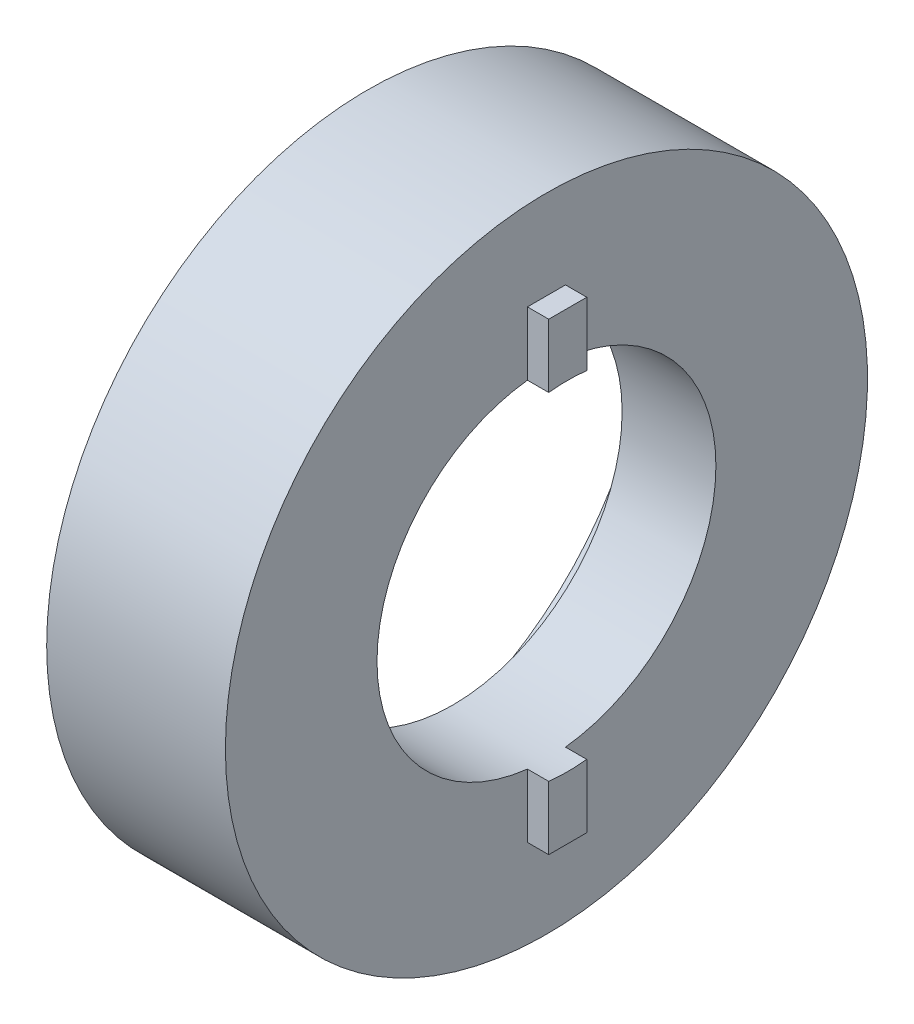
ISO-10303-21;
HEADER;
FILE_DESCRIPTION(('STEP AP214'),'2;1');
FILE_NAME('part.step','',(''),(''),'','','');
FILE_SCHEMA(('AUTOMOTIVE_DESIGN { 1 0 10303 214 1 1 1 1 }'));
ENDSEC;
DATA;
#1=APPLICATION_CONTEXT('core data for automotive mechanical design processes');
#2=APPLICATION_PROTOCOL_DEFINITION('international standard','automotive_design',2000,#1);
#3=PRODUCT_CONTEXT('',#1,'mechanical');
#4=PRODUCT('Part','Part','',(#3));
#5=PRODUCT_RELATED_PRODUCT_CATEGORY('part','',(#4));
#6=PRODUCT_DEFINITION_FORMATION('','',#4);
#7=PRODUCT_DEFINITION_CONTEXT('part definition',#1,'design');
#8=PRODUCT_DEFINITION('design','',#6,#7);
#9=PRODUCT_DEFINITION_SHAPE('','',#8);
#10=(LENGTH_UNIT() NAMED_UNIT(*) SI_UNIT(.MILLI.,.METRE.));
#11=(NAMED_UNIT(*) PLANE_ANGLE_UNIT() SI_UNIT($,.RADIAN.));
#12=(NAMED_UNIT(*) SI_UNIT($,.STERADIAN.) SOLID_ANGLE_UNIT());
#13=UNCERTAINTY_MEASURE_WITH_UNIT(LENGTH_MEASURE(1.E-05),#10,'distance_accuracy_value','');
#14=(GEOMETRIC_REPRESENTATION_CONTEXT(3) GLOBAL_UNCERTAINTY_ASSIGNED_CONTEXT((#13)) GLOBAL_UNIT_ASSIGNED_CONTEXT((#10,
#11,#12)) REPRESENTATION_CONTEXT('',''));
#15=CARTESIAN_POINT('',(0.,0.,0.));
#16=DIRECTION('',(0.,0.,1.));
#17=DIRECTION('',(1.,0.,0.));
#18=AXIS2_PLACEMENT_3D('',#15,#16,#17);
#19=CARTESIAN_POINT('',(22.4282,26.,2.1336));
#20=DIRECTION('',(0.,0.,-1.));
#21=DIRECTION('',(0.,1.,0.));
#22=AXIS2_PLACEMENT_3D('',#19,#20,#21);
#23=PLANE('',#22);
#24=DIRECTION('',(0.,-1.,0.));
#25=VECTOR('',#24,1.);
#26=CARTESIAN_POINT('',(22.4282,26.,2.1336));
#27=LINE('',#26,#25);
#28=CARTESIAN_POINT('',(22.4282,-18.8798239144331,2.1336));
#29=VERTEX_POINT('',#28);
#30=CARTESIAN_POINT('',(22.4282,-26.,2.1336));
#31=VERTEX_POINT('',#30);
#32=EDGE_CURVE('E128',#29,#31,#27,.T.);
#33=ORIENTED_EDGE('',*,*,#32,.F.);
#34=DIRECTION('',(-1.,0.,0.));
#35=VECTOR('',#34,1.);
#36=CARTESIAN_POINT('',(22.4282,-18.8798239144331,2.1336));
#37=LINE('',#36,#35);
#38=CARTESIAN_POINT('',(20.0406,-18.8798239144331,2.1336));
#39=VERTEX_POINT('',#38);
#40=EDGE_CURVE('E53',#29,#39,#37,.T.);
#41=ORIENTED_EDGE('',*,*,#40,.T.);
#42=DIRECTION('',(0.,-1.,0.));
#43=VECTOR('',#42,1.);
#44=CARTESIAN_POINT('',(20.0406,26.,2.1336));
#45=LINE('',#44,#43);
#46=CARTESIAN_POINT('',(20.0406,-26.,2.1336));
#47=VERTEX_POINT('',#46);
#48=EDGE_CURVE('E144',#39,#47,#45,.T.);
#49=ORIENTED_EDGE('',*,*,#48,.T.);
#50=DIRECTION('',(-1.,0.,0.));
#51=VECTOR('',#50,1.);
#52=CARTESIAN_POINT('',(22.4282,-26.,2.1336));
#53=LINE('',#52,#51);
#54=EDGE_CURVE('E156',#31,#47,#53,.T.);
#55=ORIENTED_EDGE('',*,*,#54,.F.);
#56=EDGE_LOOP('',(#33,#41,#49,#55));
#57=FACE_BOUND('',#56,.T.);
#58=ADVANCED_FACE('F38',(#57),#23,.F.);
#59=CARTESIAN_POINT('',(22.4282,26.,-2.1336));
#60=DIRECTION('',(0.,0.,1.));
#61=DIRECTION('',(0.,-1.,0.));
#62=AXIS2_PLACEMENT_3D('',#59,#60,#61);
#63=PLANE('',#62);
#64=DIRECTION('',(0.,1.,0.));
#65=VECTOR('',#64,1.);
#66=CARTESIAN_POINT('',(22.4282,26.,-2.1336));
#67=LINE('',#66,#65);
#68=CARTESIAN_POINT('',(22.4282,18.8798239144331,-2.1336));
#69=VERTEX_POINT('',#68);
#70=CARTESIAN_POINT('',(22.4282,26.,-2.1336));
#71=VERTEX_POINT('',#70);
#72=EDGE_CURVE('E130',#69,#71,#67,.T.);
#73=ORIENTED_EDGE('',*,*,#72,.F.);
#74=DIRECTION('',(-1.,0.,0.));
#75=VECTOR('',#74,1.);
#76=CARTESIAN_POINT('',(22.4282,18.8798239144331,-2.1336));
#77=LINE('',#76,#75);
#78=CARTESIAN_POINT('',(20.0406,18.8798239144331,-2.1336));
#79=VERTEX_POINT('',#78);
#80=EDGE_CURVE('E107',#69,#79,#77,.T.);
#81=ORIENTED_EDGE('',*,*,#80,.T.);
#82=DIRECTION('',(0.,1.,0.));
#83=VECTOR('',#82,1.);
#84=CARTESIAN_POINT('',(20.0406,26.,-2.1336));
#85=LINE('',#84,#83);
#86=CARTESIAN_POINT('',(20.0406,26.,-2.1336));
#87=VERTEX_POINT('',#86);
#88=EDGE_CURVE('E60',#79,#87,#85,.T.);
#89=ORIENTED_EDGE('',*,*,#88,.T.);
#90=DIRECTION('',(-1.,0.,0.));
#91=VECTOR('',#90,1.);
#92=CARTESIAN_POINT('',(22.4282,26.,-2.1336));
#93=LINE('',#92,#91);
#94=EDGE_CURVE('E151',#71,#87,#93,.T.);
#95=ORIENTED_EDGE('',*,*,#94,.F.);
#96=EDGE_LOOP('',(#73,#81,#89,#95));
#97=FACE_BOUND('',#96,.T.);
#98=ADVANCED_FACE('F187',(#97),#63,.F.);
#99=CARTESIAN_POINT('',(22.4282,-26.,2.1336));
#100=DIRECTION('',(-1.,0.,0.));
#101=DIRECTION('',(0.,0.,1.));
#102=AXIS2_PLACEMENT_3D('',#99,#100,#101);
#103=PLANE('',#102);
#104=CARTESIAN_POINT('',(22.4282,26.,2.1336));
#105=VERTEX_POINT('',#104);
#106=CARTESIAN_POINT('',(22.4282,18.8798239144331,2.1336));
#107=VERTEX_POINT('',#106);
#108=EDGE_CURVE('E118',#105,#107,#27,.T.);
#109=ORIENTED_EDGE('',*,*,#108,.T.);
#110=CARTESIAN_POINT('',(22.4282,0.,0.));
#111=DIRECTION('',(-1.,0.,0.));
#112=DIRECTION('',(0.,0.,1.));
#113=AXIS2_PLACEMENT_3D('',#110,#111,#112);
#114=CIRCLE('',#113,19.);
#115=EDGE_CURVE('E102',#107,#69,#114,.T.);
#116=ORIENTED_EDGE('',*,*,#115,.T.);
#117=ORIENTED_EDGE('',*,*,#72,.T.);
#118=DIRECTION('',(0.,0.,1.));
#119=VECTOR('',#118,1.);
#120=CARTESIAN_POINT('',(22.4282,26.,-2.1336));
#121=LINE('',#120,#119);
#122=EDGE_CURVE('E125',#71,#105,#121,.T.);
#123=ORIENTED_EDGE('',*,*,#122,.T.);
#124=EDGE_LOOP('',(#109,#116,#117,#123));
#125=FACE_BOUND('',#124,.T.);
#126=ADVANCED_FACE('F123',(#125),#103,.F.);
#127=CARTESIAN_POINT('',(20.0406,0.,0.));
#128=DIRECTION('',(1.,0.,0.));
#129=DIRECTION('',(0.,0.,-1.));
#130=AXIS2_PLACEMENT_3D('',#127,#128,#129);
#131=PLANE('',#130);
#132=CARTESIAN_POINT('',(20.0406,0.,0.));
#133=DIRECTION('',(1.,0.,0.));
#134=DIRECTION('',(0.,0.,-1.));
#135=AXIS2_PLACEMENT_3D('',#132,#133,#134);
#136=CIRCLE('',#135,19.);
#137=CARTESIAN_POINT('',(20.0406,18.8798239144331,2.1336));
#138=VERTEX_POINT('',#137);
#139=EDGE_CURVE('E121',#138,#39,#136,.T.);
#140=ORIENTED_EDGE('',*,*,#139,.F.);
#141=CARTESIAN_POINT('',(20.0406,26.,2.1336));
#142=VERTEX_POINT('',#141);
#143=EDGE_CURVE('E120',#142,#138,#45,.T.);
#144=ORIENTED_EDGE('',*,*,#143,.F.);
#145=DIRECTION('',(0.,0.,1.));
#146=VECTOR('',#145,1.);
#147=CARTESIAN_POINT('',(20.0406,26.,-2.1336));
#148=LINE('',#147,#146);
#149=EDGE_CURVE('E132',#87,#142,#148,.T.);
#150=ORIENTED_EDGE('',*,*,#149,.F.);
#151=ORIENTED_EDGE('',*,*,#88,.F.);
#152=CARTESIAN_POINT('',(20.0406,-18.8798239144331,-2.1336));
#153=VERTEX_POINT('',#152);
#154=EDGE_CURVE('E223',#153,#79,#136,.T.);
#155=ORIENTED_EDGE('',*,*,#154,.F.);
#156=CARTESIAN_POINT('',(20.0406,-26.,-2.1336));
#157=VERTEX_POINT('',#156);
#158=EDGE_CURVE('E146',#157,#153,#85,.T.);
#159=ORIENTED_EDGE('',*,*,#158,.F.);
#160=DIRECTION('',(0.,0.,-1.));
#161=VECTOR('',#160,1.);
#162=CARTESIAN_POINT('',(20.0406,-26.,-2.1336));
#163=LINE('',#162,#161);
#164=EDGE_CURVE('E143',#47,#157,#163,.T.);
#165=ORIENTED_EDGE('',*,*,#164,.F.);
#166=ORIENTED_EDGE('',*,*,#48,.F.);
#167=EDGE_LOOP('',(#140,#144,#150,#151,#155,#159,#165,#166));
#168=FACE_BOUND('',#167,.T.);
#169=CARTESIAN_POINT('',(20.0406,0.,0.));
#170=DIRECTION('',(1.,0.,0.));
#171=DIRECTION('',(0.,0.,-1.));
#172=AXIS2_PLACEMENT_3D('',#169,#170,#171);
#173=CIRCLE('',#172,36.);
#174=CARTESIAN_POINT('',(20.0406,0.,36.));
#175=VERTEX_POINT('',#174);
#176=EDGE_CURVE('E46',#175,#175,#173,.T.);
#177=ORIENTED_EDGE('',*,*,#176,.T.);
#178=EDGE_LOOP('',(#177));
#179=FACE_BOUND('',#178,.T.);
#180=ADVANCED_FACE('F182',(#168,#179),#131,.T.);
#181=CARTESIAN_POINT('',(20.0406,0.,0.));
#182=DIRECTION('',(-1.,0.,0.));
#183=DIRECTION('',(0.,0.,1.));
#184=AXIS2_PLACEMENT_3D('',#181,#182,#183);
#185=CYLINDRICAL_SURFACE('',#184,36.);
#186=CARTESIAN_POINT('',(0.,0.,0.));
#187=DIRECTION('',(1.,0.,0.));
#188=DIRECTION('',(0.,0.,-1.));
#189=AXIS2_PLACEMENT_3D('',#186,#187,#188);
#190=CIRCLE('',#189,36.);
#191=CARTESIAN_POINT('',(0.,0.,36.));
#192=VERTEX_POINT('',#191);
#193=EDGE_CURVE('E163',#192,#192,#190,.T.);
#194=CARTESIAN_POINT('',(20.0406,0.,36.));
#195=CARTESIAN_POINT('',(19.83184375,0.,36.));
#196=CARTESIAN_POINT('',(19.6230875,0.,36.));
#197=CARTESIAN_POINT('',(19.205575,0.,36.));
#198=CARTESIAN_POINT('',(18.99681875,0.,36.));
#199=CARTESIAN_POINT('',(18.57930625,0.,36.));
#200=CARTESIAN_POINT('',(18.37055,0.,36.));
#201=CARTESIAN_POINT('',(17.9530375,0.,36.));
#202=CARTESIAN_POINT('',(17.74428125,0.,36.));
#203=CARTESIAN_POINT('',(17.32676875,0.,36.));
#204=CARTESIAN_POINT('',(17.1180125,0.,36.));
#205=CARTESIAN_POINT('',(16.7005,0.,36.));
#206=CARTESIAN_POINT('',(16.49174375,0.,36.));
#207=CARTESIAN_POINT('',(16.07423125,0.,36.));
#208=CARTESIAN_POINT('',(15.865475,0.,36.));
#209=CARTESIAN_POINT('',(15.4479625,0.,36.));
#210=CARTESIAN_POINT('',(15.23920625,0.,36.));
#211=CARTESIAN_POINT('',(14.82169375,0.,36.));
#212=CARTESIAN_POINT('',(14.6129375,0.,36.));
#213=CARTESIAN_POINT('',(14.195425,0.,36.));
#214=CARTESIAN_POINT('',(13.98666875,0.,36.));
#215=CARTESIAN_POINT('',(13.56915625,0.,36.));
#216=CARTESIAN_POINT('',(13.3604,0.,36.));
#217=CARTESIAN_POINT('',(12.9428875,0.,36.));
#218=CARTESIAN_POINT('',(12.73413125,0.,36.));
#219=CARTESIAN_POINT('',(12.31661875,0.,36.));
#220=CARTESIAN_POINT('',(12.1078625,0.,36.));
#221=CARTESIAN_POINT('',(11.69035,0.,36.));
#222=CARTESIAN_POINT('',(11.48159375,0.,36.));
#223=CARTESIAN_POINT('',(11.06408125,0.,36.));
#224=CARTESIAN_POINT('',(10.855325,0.,36.));
#225=CARTESIAN_POINT('',(10.4378125,0.,36.));
#226=CARTESIAN_POINT('',(10.22905625,0.,36.));
#227=CARTESIAN_POINT('',(9.81154374999999,0.,36.));
#228=CARTESIAN_POINT('',(9.6027875,0.,36.));
#229=CARTESIAN_POINT('',(9.18527499999999,0.,36.));
#230=CARTESIAN_POINT('',(8.97651874999999,0.,36.));
#231=CARTESIAN_POINT('',(8.55900625,0.,36.));
#232=CARTESIAN_POINT('',(8.35025,0.,36.));
#233=CARTESIAN_POINT('',(7.93273749999999,0.,36.));
#234=CARTESIAN_POINT('',(7.72398125,0.,36.));
#235=CARTESIAN_POINT('',(7.30646875,0.,36.));
#236=CARTESIAN_POINT('',(7.09771249999999,0.,36.));
#237=CARTESIAN_POINT('',(6.68019999999999,0.,36.));
#238=CARTESIAN_POINT('',(6.47144375,0.,36.));
#239=CARTESIAN_POINT('',(6.05393125,0.,36.));
#240=CARTESIAN_POINT('',(5.84517499999999,0.,36.));
#241=CARTESIAN_POINT('',(5.42766249999999,0.,36.));
#242=CARTESIAN_POINT('',(5.21890624999999,0.,36.));
#243=CARTESIAN_POINT('',(4.80139375,0.,36.));
#244=CARTESIAN_POINT('',(4.5926375,0.,36.));
#245=CARTESIAN_POINT('',(4.175125,0.,36.));
#246=CARTESIAN_POINT('',(3.96636875,0.,36.));
#247=CARTESIAN_POINT('',(3.54885625,0.,36.));
#248=CARTESIAN_POINT('',(3.3401,0.,36.));
#249=CARTESIAN_POINT('',(2.9225875,0.,36.));
#250=CARTESIAN_POINT('',(2.71383125,0.,36.));
#251=CARTESIAN_POINT('',(2.29631875,0.,36.));
#252=CARTESIAN_POINT('',(2.0875625,0.,36.));
#253=CARTESIAN_POINT('',(1.67005,0.,36.));
#254=CARTESIAN_POINT('',(1.46129375,0.,36.));
#255=CARTESIAN_POINT('',(1.04378125,0.,36.));
#256=CARTESIAN_POINT('',(0.835024999999996,0.,36.));
#257=CARTESIAN_POINT('',(0.417512499999996,0.,36.));
#258=CARTESIAN_POINT('',(0.208756249999996,0.,36.));
#259=CARTESIAN_POINT('',(0.,0.,36.));
#260=B_SPLINE_CURVE_WITH_KNOTS('',3,(#194,#195,#196,#197,#198,#199,#200,#201,#202,#203,#204,
#205,#206,#207,#208,#209,#210,#211,#212,#213,#214,#215,#216,#217,#218,#219,#220,#221,#222,#223,
#224,#225,#226,#227,#228,#229,#230,#231,#232,#233,#234,#235,#236,#237,#238,#239,#240,#241,#242,
#243,#244,#245,#246,#247,#248,#249,#250,#251,#252,#253,#254,#255,#256,#257,#258,#259),
.UNSPECIFIED.,.F.,.F.,(4,2,2,2,2,2,2,2,2,2,2,2,2,2,2,2,2,2,2,2,2,2,2,2,2,2,2,2,2,2,2,2,4),(0.,
0.626268750000002,1.2525375,1.87880625,2.505075,3.13134375,3.7576125,4.38388125,5.01015,
5.63641875,6.2626875,6.88895625,7.515225,8.14149375,8.7677625,9.39403125,10.0203,10.64656875,
11.2728375,11.89910625,12.525375,13.15164375,13.7779125,14.40418125,15.03045,15.65671875,
16.2829875,16.90925625,17.535525,18.16179375,18.7880625,19.41433125,20.0406),.UNSPECIFIED.);
#261=EDGE_CURVE('BSEAM40',#175,#192,#260,.T.);
#262=ORIENTED_EDGE('',*,*,#176,.F.);
#263=ORIENTED_EDGE('',*,*,#193,.T.);
#264=ORIENTED_EDGE('',*,*,#261,.T.);
#265=ORIENTED_EDGE('',*,*,#261,.F.);
#266=EDGE_LOOP('',(#262,#264,#263,#265));
#267=FACE_BOUND('',#266,.T.);
#268=ADVANCED_FACE('F40',(#267),#185,.T.);
#269=CARTESIAN_POINT('',(0.,0.,0.));
#270=DIRECTION('',(1.,0.,0.));
#271=DIRECTION('',(0.,0.,-1.));
#272=AXIS2_PLACEMENT_3D('',#269,#270,#271);
#273=PLANE('',#272);
#274=CARTESIAN_POINT('',(0.,0.,0.));
#275=DIRECTION('',(-1.,0.,0.));
#276=DIRECTION('',(0.,0.,1.));
#277=AXIS2_PLACEMENT_3D('',#274,#275,#276);
#278=CIRCLE('',#277,31.75);
#279=CARTESIAN_POINT('',(0.,0.,31.75));
#280=VERTEX_POINT('',#279);
#281=EDGE_CURVE('E159',#280,#280,#278,.T.);
#282=ORIENTED_EDGE('',*,*,#281,.F.);
#283=EDGE_LOOP('',(#282));
#284=FACE_BOUND('',#283,.T.);
#285=ORIENTED_EDGE('',*,*,#193,.F.);
#286=EDGE_LOOP('',(#285));
#287=FACE_BOUND('',#286,.T.);
#288=ADVANCED_FACE('F171',(#284,#287),#273,.F.);
#289=CARTESIAN_POINT('',(9.525,0.,0.));
#290=DIRECTION('',(-1.,0.,0.));
#291=DIRECTION('',(0.,0.,1.));
#292=AXIS2_PLACEMENT_3D('',#289,#290,#291);
#293=CYLINDRICAL_SURFACE('',#292,31.75);
#294=CARTESIAN_POINT('',(9.525,0.,0.));
#295=DIRECTION('',(-1.,0.,0.));
#296=DIRECTION('',(0.,0.,1.));
#297=AXIS2_PLACEMENT_3D('',#294,#295,#296);
#298=CIRCLE('',#297,31.75);
#299=CARTESIAN_POINT('',(9.525,0.,31.75));
#300=VERTEX_POINT('',#299);
#301=EDGE_CURVE('E160',#300,#300,#298,.T.);
#302=CARTESIAN_POINT('',(9.525,0.,31.75));
#303=CARTESIAN_POINT('',(9.42578125,0.,31.75));
#304=CARTESIAN_POINT('',(9.3265625,0.,31.75));
#305=CARTESIAN_POINT('',(9.128125,0.,31.75));
#306=CARTESIAN_POINT('',(9.02890625,0.,31.75));
#307=CARTESIAN_POINT('',(8.83046875,0.,31.75));
#308=CARTESIAN_POINT('',(8.73125,0.,31.75));
#309=CARTESIAN_POINT('',(8.5328125,0.,31.75));
#310=CARTESIAN_POINT('',(8.43359375,0.,31.75));
#311=CARTESIAN_POINT('',(8.23515625,0.,31.75));
#312=CARTESIAN_POINT('',(8.1359375,0.,31.75));
#313=CARTESIAN_POINT('',(7.9375,0.,31.75));
#314=CARTESIAN_POINT('',(7.83828125,0.,31.75));
#315=CARTESIAN_POINT('',(7.63984375,0.,31.75));
#316=CARTESIAN_POINT('',(7.540625,0.,31.75));
#317=CARTESIAN_POINT('',(7.3421875,0.,31.75));
#318=CARTESIAN_POINT('',(7.24296875,0.,31.75));
#319=CARTESIAN_POINT('',(7.04453125,0.,31.75));
#320=CARTESIAN_POINT('',(6.9453125,0.,31.75));
#321=CARTESIAN_POINT('',(6.746875,0.,31.75));
#322=CARTESIAN_POINT('',(6.64765625,0.,31.75));
#323=CARTESIAN_POINT('',(6.44921875,0.,31.75));
#324=CARTESIAN_POINT('',(6.35,0.,31.75));
#325=CARTESIAN_POINT('',(6.1515625,0.,31.75));
#326=CARTESIAN_POINT('',(6.05234375,0.,31.75));
#327=CARTESIAN_POINT('',(5.85390625,0.,31.75));
#328=CARTESIAN_POINT('',(5.7546875,0.,31.75));
#329=CARTESIAN_POINT('',(5.55625,0.,31.75));
#330=CARTESIAN_POINT('',(5.45703125,0.,31.75));
#331=CARTESIAN_POINT('',(5.25859375,0.,31.75));
#332=CARTESIAN_POINT('',(5.159375,0.,31.75));
#333=CARTESIAN_POINT('',(4.9609375,0.,31.75));
#334=CARTESIAN_POINT('',(4.86171875,0.,31.75));
#335=CARTESIAN_POINT('',(4.66328125,0.,31.75));
#336=CARTESIAN_POINT('',(4.5640625,0.,31.75));
#337=CARTESIAN_POINT('',(4.365625,0.,31.75));
#338=CARTESIAN_POINT('',(4.26640625,0.,31.75));
#339=CARTESIAN_POINT('',(4.06796875,0.,31.75));
#340=CARTESIAN_POINT('',(3.96875,0.,31.75));
#341=CARTESIAN_POINT('',(3.7703125,0.,31.75));
#342=CARTESIAN_POINT('',(3.67109375,0.,31.75));
#343=CARTESIAN_POINT('',(3.47265625,0.,31.75));
#344=CARTESIAN_POINT('',(3.3734375,0.,31.75));
#345=CARTESIAN_POINT('',(3.175,0.,31.75));
#346=CARTESIAN_POINT('',(3.07578125,0.,31.75));
#347=CARTESIAN_POINT('',(2.87734375,0.,31.75));
#348=CARTESIAN_POINT('',(2.778125,0.,31.75));
#349=CARTESIAN_POINT('',(2.5796875,0.,31.75));
#350=CARTESIAN_POINT('',(2.48046875,0.,31.75));
#351=CARTESIAN_POINT('',(2.28203125,0.,31.75));
#352=CARTESIAN_POINT('',(2.1828125,0.,31.75));
#353=CARTESIAN_POINT('',(1.984375,0.,31.75));
#354=CARTESIAN_POINT('',(1.88515625,0.,31.75));
#355=CARTESIAN_POINT('',(1.68671875,0.,31.75));
#356=CARTESIAN_POINT('',(1.5875,0.,31.75));
#357=CARTESIAN_POINT('',(1.3890625,0.,31.75));
#358=CARTESIAN_POINT('',(1.28984375,0.,31.75));
#359=CARTESIAN_POINT('',(1.09140625,0.,31.75));
#360=CARTESIAN_POINT('',(0.992187500000001,0.,31.75));
#361=CARTESIAN_POINT('',(0.793750000000001,0.,31.75));
#362=CARTESIAN_POINT('',(0.69453125,0.,31.75));
#363=CARTESIAN_POINT('',(0.49609375,0.,31.75));
#364=CARTESIAN_POINT('',(0.396875,0.,31.75));
#365=CARTESIAN_POINT('',(0.1984375,0.,31.75));
#366=CARTESIAN_POINT('',(0.0992187500000001,0.,31.75));
#367=CARTESIAN_POINT('',(0.,0.,31.75));
#368=B_SPLINE_CURVE_WITH_KNOTS('',3,(#302,#303,#304,#305,#306,#307,#308,#309,#310,#311,#312,
#313,#314,#315,#316,#317,#318,#319,#320,#321,#322,#323,#324,#325,#326,#327,#328,#329,#330,#331,
#332,#333,#334,#335,#336,#337,#338,#339,#340,#341,#342,#343,#344,#345,#346,#347,#348,#349,#350,
#351,#352,#353,#354,#355,#356,#357,#358,#359,#360,#361,#362,#363,#364,#365,#366,#367),
.UNSPECIFIED.,.F.,.F.,(4,2,2,2,2,2,2,2,2,2,2,2,2,2,2,2,2,2,2,2,2,2,2,2,2,2,2,2,2,2,2,2,4),(0.,
0.29765625,0.5953125,0.892968750000001,1.190625,1.48828125,1.7859375,2.08359375,2.38125,
2.67890625,2.9765625,3.27421875,3.571875,3.86953125,4.1671875,4.46484375,4.7625,5.06015625,
5.3578125,5.65546875,5.953125,6.25078125,6.5484375,6.84609375,7.14375,7.44140625,7.7390625,
8.03671875,8.334375,8.63203125,8.9296875,9.22734375,9.525),.UNSPECIFIED.);
#369=EDGE_CURVE('BSEAM173',#300,#280,#368,.T.);
#370=ORIENTED_EDGE('',*,*,#301,.F.);
#371=ORIENTED_EDGE('',*,*,#281,.T.);
#372=ORIENTED_EDGE('',*,*,#369,.T.);
#373=ORIENTED_EDGE('',*,*,#369,.F.);
#374=EDGE_LOOP('',(#370,#372,#371,#373));
#375=FACE_BOUND('',#374,.T.);
#376=ADVANCED_FACE('F173',(#375),#293,.F.);
#377=CARTESIAN_POINT('',(9.525,0.,0.));
#378=DIRECTION('',(-1.,0.,0.));
#379=DIRECTION('',(0.,0.,1.));
#380=AXIS2_PLACEMENT_3D('',#377,#378,#379);
#381=PLANE('',#380);
#382=CARTESIAN_POINT('',(9.525,0.,0.));
#383=DIRECTION('',(-1.,0.,0.));
#384=DIRECTION('',(0.,0.,1.));
#385=AXIS2_PLACEMENT_3D('',#382,#383,#384);
#386=CIRCLE('',#385,19.);
#387=CARTESIAN_POINT('',(9.525,0.,19.));
#388=VERTEX_POINT('',#387);
#389=EDGE_CURVE('E134',#388,#388,#386,.T.);
#390=ORIENTED_EDGE('',*,*,#389,.F.);
#391=EDGE_LOOP('',(#390));
#392=FACE_BOUND('',#391,.T.);
#393=ORIENTED_EDGE('',*,*,#301,.T.);
#394=EDGE_LOOP('',(#393));
#395=FACE_BOUND('',#394,.T.);
#396=ADVANCED_FACE('F179',(#392,#395),#381,.T.);
#397=ORIENTED_EDGE('',*,*,#143,.T.);
#398=DIRECTION('',(-1.,0.,0.));
#399=VECTOR('',#398,1.);
#400=CARTESIAN_POINT('',(22.4282,18.8798239144331,2.1336));
#401=LINE('',#400,#399);
#402=EDGE_CURVE('E105',#138,#107,#401,.F.);
#403=ORIENTED_EDGE('',*,*,#402,.T.);
#404=ORIENTED_EDGE('',*,*,#108,.F.);
#405=DIRECTION('',(-1.,0.,0.));
#406=VECTOR('',#405,1.);
#407=CARTESIAN_POINT('',(22.4282,26.,2.1336));
#408=LINE('',#407,#406);
#409=EDGE_CURVE('E141',#105,#142,#408,.T.);
#410=ORIENTED_EDGE('',*,*,#409,.T.);
#411=EDGE_LOOP('',(#397,#403,#404,#410));
#412=FACE_BOUND('',#411,.T.);
#413=ADVANCED_FACE('F116',(#412),#23,.F.);
#414=CARTESIAN_POINT('',(22.4282,-26.,-2.1336));
#415=DIRECTION('',(0.,1.,0.));
#416=DIRECTION('',(0.,0.,1.));
#417=AXIS2_PLACEMENT_3D('',#414,#415,#416);
#418=PLANE('',#417);
#419=ORIENTED_EDGE('',*,*,#164,.T.);
#420=DIRECTION('',(-1.,0.,0.));
#421=VECTOR('',#420,1.);
#422=CARTESIAN_POINT('',(22.4282,-26.,-2.1336));
#423=LINE('',#422,#421);
#424=CARTESIAN_POINT('',(22.4282,-26.,-2.1336));
#425=VERTEX_POINT('',#424);
#426=EDGE_CURVE('E153',#425,#157,#423,.T.);
#427=ORIENTED_EDGE('',*,*,#426,.F.);
#428=DIRECTION('',(0.,0.,-1.));
#429=VECTOR('',#428,1.);
#430=CARTESIAN_POINT('',(22.4282,-26.,-2.1336));
#431=LINE('',#430,#429);
#432=EDGE_CURVE('E127',#31,#425,#431,.T.);
#433=ORIENTED_EDGE('',*,*,#432,.F.);
#434=ORIENTED_EDGE('',*,*,#54,.T.);
#435=EDGE_LOOP('',(#419,#427,#433,#434));
#436=FACE_BOUND('',#435,.T.);
#437=ADVANCED_FACE('F199',(#436),#418,.F.);
#438=ORIENTED_EDGE('',*,*,#158,.T.);
#439=DIRECTION('',(-1.,0.,0.));
#440=VECTOR('',#439,1.);
#441=CARTESIAN_POINT('',(22.4282,-18.8798239144331,-2.1336));
#442=LINE('',#441,#440);
#443=CARTESIAN_POINT('',(22.4282,-18.8798239144331,-2.1336));
#444=VERTEX_POINT('',#443);
#445=EDGE_CURVE('E111',#153,#444,#442,.F.);
#446=ORIENTED_EDGE('',*,*,#445,.T.);
#447=EDGE_CURVE('E137',#425,#444,#67,.T.);
#448=ORIENTED_EDGE('',*,*,#447,.F.);
#449=ORIENTED_EDGE('',*,*,#426,.T.);
#450=EDGE_LOOP('',(#438,#446,#448,#449));
#451=FACE_BOUND('',#450,.T.);
#452=ADVANCED_FACE('F194',(#451),#63,.F.);
#453=CARTESIAN_POINT('',(22.4282,26.,-2.1336));
#454=DIRECTION('',(0.,-1.,0.));
#455=DIRECTION('',(0.,0.,-1.));
#456=AXIS2_PLACEMENT_3D('',#453,#454,#455);
#457=PLANE('',#456);
#458=ORIENTED_EDGE('',*,*,#149,.T.);
#459=ORIENTED_EDGE('',*,*,#409,.F.);
#460=ORIENTED_EDGE('',*,*,#122,.F.);
#461=ORIENTED_EDGE('',*,*,#94,.T.);
#462=EDGE_LOOP('',(#458,#459,#460,#461));
#463=FACE_BOUND('',#462,.T.);
#464=ADVANCED_FACE('F236',(#463),#457,.F.);
#465=ORIENTED_EDGE('',*,*,#447,.T.);
#466=CARTESIAN_POINT('',(22.4282,0.,0.));
#467=DIRECTION('',(-1.,0.,0.));
#468=DIRECTION('',(0.,0.,1.));
#469=AXIS2_PLACEMENT_3D('',#466,#467,#468);
#470=CIRCLE('',#469,19.);
#471=EDGE_CURVE('E11',#444,#29,#470,.T.);
#472=ORIENTED_EDGE('',*,*,#471,.T.);
#473=ORIENTED_EDGE('',*,*,#32,.T.);
#474=ORIENTED_EDGE('',*,*,#432,.T.);
#475=EDGE_LOOP('',(#465,#472,#473,#474));
#476=FACE_BOUND('',#475,.T.);
#477=ADVANCED_FACE('F216',(#476),#103,.F.);
#478=CARTESIAN_POINT('',(22.4282,0.,0.));
#479=DIRECTION('',(-1.,0.,0.));
#480=DIRECTION('',(0.,0.,1.));
#481=AXIS2_PLACEMENT_3D('',#478,#479,#480);
#482=CYLINDRICAL_SURFACE('',#481,19.);
#483=ORIENTED_EDGE('',*,*,#389,.T.);
#484=EDGE_LOOP('',(#483));
#485=FACE_BOUND('',#484,.T.);
#486=ORIENTED_EDGE('',*,*,#471,.F.);
#487=ORIENTED_EDGE('',*,*,#445,.F.);
#488=ORIENTED_EDGE('',*,*,#154,.T.);
#489=ORIENTED_EDGE('',*,*,#80,.F.);
#490=ORIENTED_EDGE('',*,*,#115,.F.);
#491=ORIENTED_EDGE('',*,*,#402,.F.);
#492=ORIENTED_EDGE('',*,*,#139,.T.);
#493=ORIENTED_EDGE('',*,*,#40,.F.);
#494=EDGE_LOOP('',(#486,#487,#488,#489,#490,#491,#492,#493));
#495=FACE_BOUND('',#494,.T.);
#496=ADVANCED_FACE('F104',(#485,#495),#482,.F.);
#497=CLOSED_SHELL('',(#58,#98,#126,#180,#268,#288,#376,#396,#413,#437,#452,#464,#477,#496));
#498=MANIFOLD_SOLID_BREP('B2',#497);
#499=ADVANCED_BREP_SHAPE_REPRESENTATION('',(#18,#498),#14);
#500=SHAPE_DEFINITION_REPRESENTATION(#9,#499);
ENDSEC;
END-ISO-10303-21;
